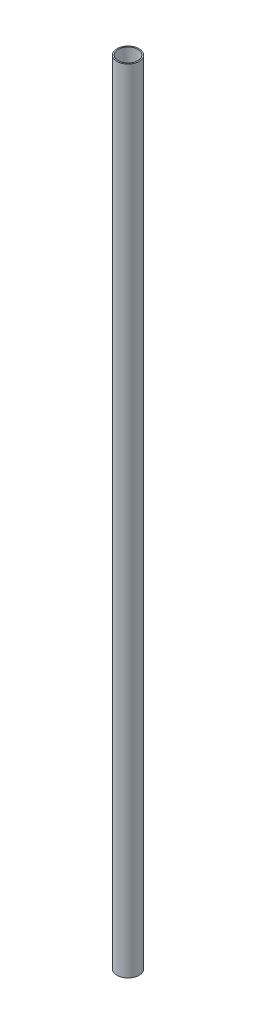
ISO-10303-21;
HEADER;
FILE_DESCRIPTION(('STEP AP214'),'2;1');
FILE_NAME('part.step','',(''),(''),'','','');
FILE_SCHEMA(('AUTOMOTIVE_DESIGN { 1 0 10303 214 1 1 1 1 }'));
ENDSEC;
DATA;
#1=APPLICATION_CONTEXT('core data for automotive mechanical design processes');
#2=APPLICATION_PROTOCOL_DEFINITION('international standard','automotive_design',2000,#1);
#3=PRODUCT_CONTEXT('',#1,'mechanical');
#4=PRODUCT('Part','Part','',(#3));
#5=PRODUCT_RELATED_PRODUCT_CATEGORY('part','',(#4));
#6=PRODUCT_DEFINITION_FORMATION('','',#4);
#7=PRODUCT_DEFINITION_CONTEXT('part definition',#1,'design');
#8=PRODUCT_DEFINITION('design','',#6,#7);
#9=PRODUCT_DEFINITION_SHAPE('','',#8);
#10=(LENGTH_UNIT() NAMED_UNIT(*) SI_UNIT(.MILLI.,.METRE.));
#11=(NAMED_UNIT(*) PLANE_ANGLE_UNIT() SI_UNIT($,.RADIAN.));
#12=(NAMED_UNIT(*) SI_UNIT($,.STERADIAN.) SOLID_ANGLE_UNIT());
#13=UNCERTAINTY_MEASURE_WITH_UNIT(LENGTH_MEASURE(1.E-05),#10,'distance_accuracy_value','');
#14=(GEOMETRIC_REPRESENTATION_CONTEXT(3) GLOBAL_UNCERTAINTY_ASSIGNED_CONTEXT((#13)) GLOBAL_UNIT_ASSIGNED_CONTEXT((#10,
#11,#12)) REPRESENTATION_CONTEXT('',''));
#15=CARTESIAN_POINT('',(0.,0.,0.));
#16=DIRECTION('',(0.,0.,1.));
#17=DIRECTION('',(1.,0.,0.));
#18=AXIS2_PLACEMENT_3D('',#15,#16,#17);
#19=CARTESIAN_POINT('',(0.,645.,0.));
#20=DIRECTION('',(0.,1.,0.));
#21=DIRECTION('',(0.,0.,1.));
#22=AXIS2_PLACEMENT_3D('',#19,#20,#21);
#23=PLANE('',#22);
#24=CARTESIAN_POINT('',(0.,645.,0.));
#25=DIRECTION('',(0.,1.,0.));
#26=DIRECTION('',(0.,0.,1.));
#27=AXIS2_PLACEMENT_3D('',#24,#25,#26);
#28=CIRCLE('',#27,9.);
#29=CARTESIAN_POINT('',(0.,645.,-9.));
#30=VERTEX_POINT('',#29);
#31=EDGE_CURVE('E10',#30,#30,#28,.T.);
#32=ORIENTED_EDGE('',*,*,#31,.T.);
#33=EDGE_LOOP('',(#32));
#34=FACE_BOUND('',#33,.T.);
#35=CARTESIAN_POINT('',(0.,645.,0.));
#36=DIRECTION('',(0.,1.,0.));
#37=DIRECTION('',(0.,0.,1.));
#38=AXIS2_PLACEMENT_3D('',#35,#36,#37);
#39=CIRCLE('',#38,8.);
#40=CARTESIAN_POINT('',(0.,645.,-8.));
#41=VERTEX_POINT('',#40);
#42=EDGE_CURVE('E43',#41,#41,#39,.T.);
#43=ORIENTED_EDGE('',*,*,#42,.F.);
#44=EDGE_LOOP('',(#43));
#45=FACE_BOUND('',#44,.T.);
#46=ADVANCED_FACE('F32',(#34,#45),#23,.T.);
#47=CARTESIAN_POINT('',(0.,0.,0.));
#48=DIRECTION('',(0.,1.,0.));
#49=DIRECTION('',(0.,0.,1.));
#50=AXIS2_PLACEMENT_3D('',#47,#48,#49);
#51=PLANE('',#50);
#52=CARTESIAN_POINT('',(0.,0.,0.));
#53=DIRECTION('',(0.,1.,0.));
#54=DIRECTION('',(0.,0.,1.));
#55=AXIS2_PLACEMENT_3D('',#52,#53,#54);
#56=CIRCLE('',#55,9.);
#57=CARTESIAN_POINT('',(0.,-1.11022302462516E-13,-9.));
#58=VERTEX_POINT('',#57);
#59=EDGE_CURVE('E36',#58,#58,#56,.T.);
#60=ORIENTED_EDGE('',*,*,#59,.F.);
#61=EDGE_LOOP('',(#60));
#62=FACE_BOUND('',#61,.T.);
#63=CARTESIAN_POINT('',(0.,0.,0.));
#64=DIRECTION('',(0.,1.,0.));
#65=DIRECTION('',(0.,0.,1.));
#66=AXIS2_PLACEMENT_3D('',#63,#64,#65);
#67=CIRCLE('',#66,8.);
#68=CARTESIAN_POINT('',(0.,-1.11022302462516E-13,-8.));
#69=VERTEX_POINT('',#68);
#70=EDGE_CURVE('E45',#69,#69,#67,.T.);
#71=ORIENTED_EDGE('',*,*,#70,.T.);
#72=EDGE_LOOP('',(#71));
#73=FACE_BOUND('',#72,.T.);
#74=ADVANCED_FACE('F55',(#62,#73),#51,.F.);
#75=CARTESIAN_POINT('',(0.,645.,0.));
#76=DIRECTION('',(0.,-1.,0.));
#77=DIRECTION('',(0.,0.,-1.));
#78=AXIS2_PLACEMENT_3D('',#75,#76,#77);
#79=CYLINDRICAL_SURFACE('',#78,9.);
#80=CARTESIAN_POINT('',(0.,645.,-9.));
#81=CARTESIAN_POINT('',(0.,638.28125,-9.));
#82=CARTESIAN_POINT('',(0.,631.5625,-9.));
#83=CARTESIAN_POINT('',(0.,618.125,-9.));
#84=CARTESIAN_POINT('',(0.,611.40625,-9.));
#85=CARTESIAN_POINT('',(0.,597.96875,-9.));
#86=CARTESIAN_POINT('',(0.,591.25,-9.));
#87=CARTESIAN_POINT('',(0.,577.8125,-9.));
#88=CARTESIAN_POINT('',(0.,571.09375,-9.));
#89=CARTESIAN_POINT('',(0.,557.65625,-9.));
#90=CARTESIAN_POINT('',(0.,550.9375,-9.));
#91=CARTESIAN_POINT('',(0.,537.5,-9.));
#92=CARTESIAN_POINT('',(0.,530.78125,-9.));
#93=CARTESIAN_POINT('',(0.,517.34375,-9.));
#94=CARTESIAN_POINT('',(0.,510.625,-9.));
#95=CARTESIAN_POINT('',(0.,497.1875,-9.));
#96=CARTESIAN_POINT('',(0.,490.46875,-9.));
#97=CARTESIAN_POINT('',(0.,477.03125,-9.));
#98=CARTESIAN_POINT('',(0.,470.3125,-9.));
#99=CARTESIAN_POINT('',(0.,456.875,-9.));
#100=CARTESIAN_POINT('',(0.,450.15625,-9.));
#101=CARTESIAN_POINT('',(0.,436.71875,-9.));
#102=CARTESIAN_POINT('',(0.,430.,-9.));
#103=CARTESIAN_POINT('',(0.,416.5625,-9.));
#104=CARTESIAN_POINT('',(0.,409.84375,-9.));
#105=CARTESIAN_POINT('',(0.,396.40625,-9.));
#106=CARTESIAN_POINT('',(0.,389.6875,-9.));
#107=CARTESIAN_POINT('',(0.,376.25,-9.));
#108=CARTESIAN_POINT('',(0.,369.53125,-9.));
#109=CARTESIAN_POINT('',(0.,356.09375,-9.));
#110=CARTESIAN_POINT('',(0.,349.375,-9.));
#111=CARTESIAN_POINT('',(0.,335.9375,-9.));
#112=CARTESIAN_POINT('',(0.,329.21875,-9.));
#113=CARTESIAN_POINT('',(0.,315.78125,-9.));
#114=CARTESIAN_POINT('',(0.,309.0625,-9.));
#115=CARTESIAN_POINT('',(0.,295.625,-9.));
#116=CARTESIAN_POINT('',(0.,288.90625,-9.));
#117=CARTESIAN_POINT('',(0.,275.46875,-9.));
#118=CARTESIAN_POINT('',(0.,268.75,-9.));
#119=CARTESIAN_POINT('',(0.,255.3125,-9.));
#120=CARTESIAN_POINT('',(0.,248.59375,-9.));
#121=CARTESIAN_POINT('',(0.,235.15625,-9.));
#122=CARTESIAN_POINT('',(0.,228.4375,-9.));
#123=CARTESIAN_POINT('',(0.,215.,-9.));
#124=CARTESIAN_POINT('',(0.,208.28125,-9.));
#125=CARTESIAN_POINT('',(0.,194.84375,-9.));
#126=CARTESIAN_POINT('',(0.,188.125,-9.));
#127=CARTESIAN_POINT('',(0.,174.6875,-9.));
#128=CARTESIAN_POINT('',(0.,167.96875,-9.));
#129=CARTESIAN_POINT('',(0.,154.53125,-9.));
#130=CARTESIAN_POINT('',(0.,147.8125,-9.));
#131=CARTESIAN_POINT('',(0.,134.375,-9.));
#132=CARTESIAN_POINT('',(0.,127.65625,-9.));
#133=CARTESIAN_POINT('',(0.,114.21875,-9.));
#134=CARTESIAN_POINT('',(0.,107.5,-9.));
#135=CARTESIAN_POINT('',(0.,94.0624999999999,-9.));
#136=CARTESIAN_POINT('',(0.,87.3437499999999,-9.));
#137=CARTESIAN_POINT('',(0.,73.9062499999999,-9.));
#138=CARTESIAN_POINT('',(0.,67.1874999999999,-9.));
#139=CARTESIAN_POINT('',(0.,53.7499999999999,-9.));
#140=CARTESIAN_POINT('',(0.,47.0312499999999,-9.));
#141=CARTESIAN_POINT('',(0.,33.5937499999999,-9.));
#142=CARTESIAN_POINT('',(0.,26.8749999999999,-9.));
#143=CARTESIAN_POINT('',(0.,13.4374999999999,-9.));
#144=CARTESIAN_POINT('',(0.,6.71874999999987,-9.));
#145=CARTESIAN_POINT('',(0.,-1.11022302462516E-13,-9.));
#146=B_SPLINE_CURVE_WITH_KNOTS('',3,(#80,#81,#82,#83,#84,#85,#86,#87,#88,#89,#90,#91,#92,#93,
#94,#95,#96,#97,#98,#99,#100,#101,#102,#103,#104,#105,#106,#107,#108,#109,#110,#111,#112,#113,
#114,#115,#116,#117,#118,#119,#120,#121,#122,#123,#124,#125,#126,#127,#128,#129,#130,#131,#132,
#133,#134,#135,#136,#137,#138,#139,#140,#141,#142,#143,#144,#145),.UNSPECIFIED.,.F.,.F.,(4,2,2,
2,2,2,2,2,2,2,2,2,2,2,2,2,2,2,2,2,2,2,2,2,2,2,2,2,2,2,2,2,4),(0.,20.15625,40.3125,60.46875,
80.6249999999999,100.78125,120.9375,141.09375,161.25,181.40625,201.5625,221.71875,241.875,
262.03125,282.1875,302.34375,322.5,342.65625,362.8125,382.96875,403.125,423.28125,443.4375,
463.59375,483.75,503.90625,524.0625,544.21875,564.375,584.53125,604.6875,624.84375,645.),.UNSPECIFIED.);
#147=EDGE_CURVE('BSEAM34',#30,#58,#146,.T.);
#148=ORIENTED_EDGE('',*,*,#31,.F.);
#149=ORIENTED_EDGE('',*,*,#59,.T.);
#150=ORIENTED_EDGE('',*,*,#147,.T.);
#151=ORIENTED_EDGE('',*,*,#147,.F.);
#152=EDGE_LOOP('',(#148,#150,#149,#151));
#153=FACE_BOUND('',#152,.T.);
#154=ADVANCED_FACE('F34',(#153),#79,.T.);
#155=CARTESIAN_POINT('',(0.,645.,0.));
#156=DIRECTION('',(0.,-1.,0.));
#157=DIRECTION('',(0.,0.,-1.));
#158=AXIS2_PLACEMENT_3D('',#155,#156,#157);
#159=CYLINDRICAL_SURFACE('',#158,8.);
#160=CARTESIAN_POINT('',(0.,645.,-8.));
#161=CARTESIAN_POINT('',(0.,638.28125,-8.));
#162=CARTESIAN_POINT('',(0.,631.5625,-8.));
#163=CARTESIAN_POINT('',(0.,618.125,-8.));
#164=CARTESIAN_POINT('',(0.,611.40625,-8.));
#165=CARTESIAN_POINT('',(0.,597.96875,-8.));
#166=CARTESIAN_POINT('',(0.,591.25,-8.));
#167=CARTESIAN_POINT('',(0.,577.8125,-8.));
#168=CARTESIAN_POINT('',(0.,571.09375,-8.));
#169=CARTESIAN_POINT('',(0.,557.65625,-8.));
#170=CARTESIAN_POINT('',(0.,550.9375,-8.));
#171=CARTESIAN_POINT('',(0.,537.5,-8.));
#172=CARTESIAN_POINT('',(0.,530.78125,-8.));
#173=CARTESIAN_POINT('',(0.,517.34375,-8.));
#174=CARTESIAN_POINT('',(0.,510.625,-8.));
#175=CARTESIAN_POINT('',(0.,497.1875,-8.));
#176=CARTESIAN_POINT('',(0.,490.46875,-8.));
#177=CARTESIAN_POINT('',(0.,477.03125,-8.));
#178=CARTESIAN_POINT('',(0.,470.3125,-8.));
#179=CARTESIAN_POINT('',(0.,456.875,-8.));
#180=CARTESIAN_POINT('',(0.,450.15625,-8.));
#181=CARTESIAN_POINT('',(0.,436.71875,-8.));
#182=CARTESIAN_POINT('',(0.,430.,-8.));
#183=CARTESIAN_POINT('',(0.,416.5625,-8.));
#184=CARTESIAN_POINT('',(0.,409.84375,-8.));
#185=CARTESIAN_POINT('',(0.,396.40625,-8.));
#186=CARTESIAN_POINT('',(0.,389.6875,-8.));
#187=CARTESIAN_POINT('',(0.,376.25,-8.));
#188=CARTESIAN_POINT('',(0.,369.53125,-8.));
#189=CARTESIAN_POINT('',(0.,356.09375,-8.));
#190=CARTESIAN_POINT('',(0.,349.375,-8.));
#191=CARTESIAN_POINT('',(0.,335.9375,-8.));
#192=CARTESIAN_POINT('',(0.,329.21875,-8.));
#193=CARTESIAN_POINT('',(0.,315.78125,-8.));
#194=CARTESIAN_POINT('',(0.,309.0625,-8.));
#195=CARTESIAN_POINT('',(0.,295.625,-8.));
#196=CARTESIAN_POINT('',(0.,288.90625,-8.));
#197=CARTESIAN_POINT('',(0.,275.46875,-8.));
#198=CARTESIAN_POINT('',(0.,268.75,-8.));
#199=CARTESIAN_POINT('',(0.,255.3125,-8.));
#200=CARTESIAN_POINT('',(0.,248.59375,-8.));
#201=CARTESIAN_POINT('',(0.,235.15625,-8.));
#202=CARTESIAN_POINT('',(0.,228.4375,-8.));
#203=CARTESIAN_POINT('',(0.,215.,-8.));
#204=CARTESIAN_POINT('',(0.,208.28125,-8.));
#205=CARTESIAN_POINT('',(0.,194.84375,-8.));
#206=CARTESIAN_POINT('',(0.,188.125,-8.));
#207=CARTESIAN_POINT('',(0.,174.6875,-8.));
#208=CARTESIAN_POINT('',(0.,167.96875,-8.));
#209=CARTESIAN_POINT('',(0.,154.53125,-8.));
#210=CARTESIAN_POINT('',(0.,147.8125,-8.));
#211=CARTESIAN_POINT('',(0.,134.375,-8.));
#212=CARTESIAN_POINT('',(0.,127.65625,-8.));
#213=CARTESIAN_POINT('',(0.,114.21875,-8.));
#214=CARTESIAN_POINT('',(0.,107.5,-8.));
#215=CARTESIAN_POINT('',(0.,94.0624999999999,-8.));
#216=CARTESIAN_POINT('',(0.,87.3437499999999,-8.));
#217=CARTESIAN_POINT('',(0.,73.90625,-8.));
#218=CARTESIAN_POINT('',(0.,67.1875,-8.));
#219=CARTESIAN_POINT('',(0.,53.7499999999999,-8.));
#220=CARTESIAN_POINT('',(0.,47.0312499999999,-8.));
#221=CARTESIAN_POINT('',(0.,33.5937499999999,-8.));
#222=CARTESIAN_POINT('',(0.,26.8749999999999,-8.));
#223=CARTESIAN_POINT('',(0.,13.4374999999999,-8.));
#224=CARTESIAN_POINT('',(0.,6.71874999999988,-8.));
#225=CARTESIAN_POINT('',(0.,-1.11022302462516E-13,-8.));
#226=B_SPLINE_CURVE_WITH_KNOTS('',3,(#160,#161,#162,#163,#164,#165,#166,#167,#168,#169,#170,
#171,#172,#173,#174,#175,#176,#177,#178,#179,#180,#181,#182,#183,#184,#185,#186,#187,#188,#189,
#190,#191,#192,#193,#194,#195,#196,#197,#198,#199,#200,#201,#202,#203,#204,#205,#206,#207,#208,
#209,#210,#211,#212,#213,#214,#215,#216,#217,#218,#219,#220,#221,#222,#223,#224,#225),
.UNSPECIFIED.,.F.,.F.,(4,2,2,2,2,2,2,2,2,2,2,2,2,2,2,2,2,2,2,2,2,2,2,2,2,2,2,2,2,2,2,2,4),(0.,
20.1562500000001,40.3125000000001,60.4687500000001,80.6250000000001,100.78125,120.9375,
141.09375,161.25,181.40625,201.5625,221.71875,241.875,262.03125,282.1875,302.34375,322.5,
342.65625,362.8125,382.96875,403.125,423.28125,443.4375,463.59375,483.75,503.90625,524.0625,
544.21875,564.375,584.53125,604.6875,624.84375,645.),.UNSPECIFIED.);
#227=EDGE_CURVE('BSEAM51',#41,#69,#226,.T.);
#228=ORIENTED_EDGE('',*,*,#42,.T.);
#229=ORIENTED_EDGE('',*,*,#70,.F.);
#230=ORIENTED_EDGE('',*,*,#227,.T.);
#231=ORIENTED_EDGE('',*,*,#227,.F.);
#232=EDGE_LOOP('',(#228,#230,#229,#231));
#233=FACE_BOUND('',#232,.T.);
#234=ADVANCED_FACE('F51',(#233),#159,.F.);
#235=CLOSED_SHELL('',(#46,#74,#154,#234));
#236=MANIFOLD_SOLID_BREP('B2',#235);
#237=ADVANCED_BREP_SHAPE_REPRESENTATION('',(#18,#236),#14);
#238=SHAPE_DEFINITION_REPRESENTATION(#9,#237);
ENDSEC;
END-ISO-10303-21;
